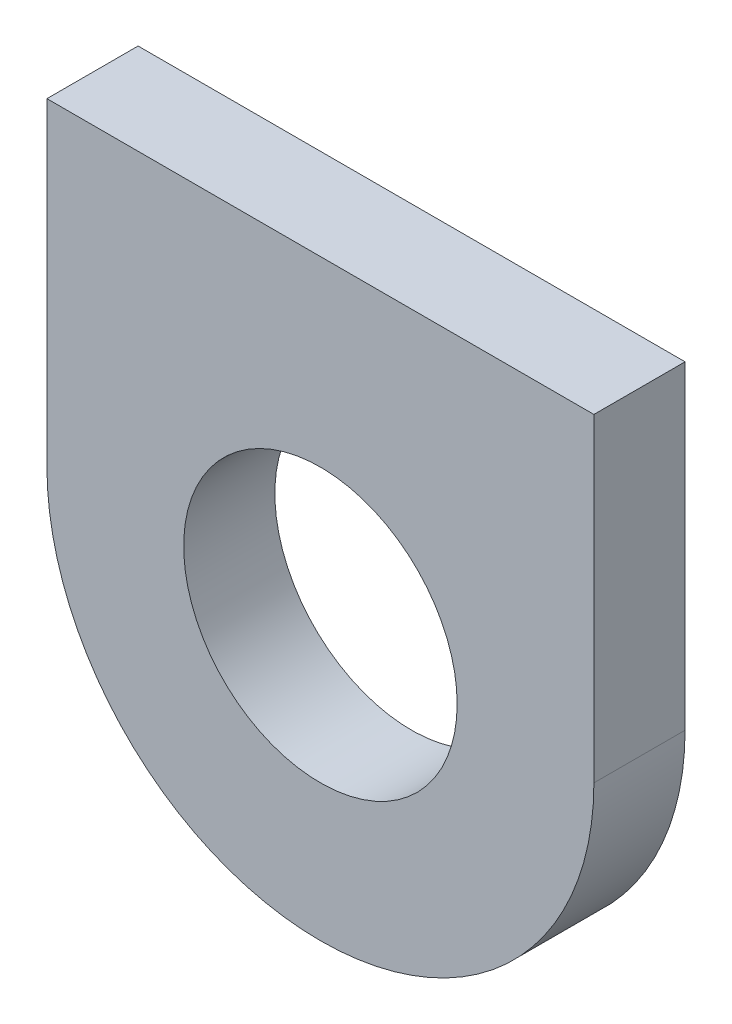
ISO-10303-21;
HEADER;
FILE_DESCRIPTION(('STEP AP214'),'2;1');
FILE_NAME('part.step','',(''),(''),'','','');
FILE_SCHEMA(('AUTOMOTIVE_DESIGN { 1 0 10303 214 1 1 1 1 }'));
ENDSEC;
DATA;
#1=APPLICATION_CONTEXT('core data for automotive mechanical design processes');
#2=APPLICATION_PROTOCOL_DEFINITION('international standard','automotive_design',2000,#1);
#3=PRODUCT_CONTEXT('',#1,'mechanical');
#4=PRODUCT('Part','Part','',(#3));
#5=PRODUCT_RELATED_PRODUCT_CATEGORY('part','',(#4));
#6=PRODUCT_DEFINITION_FORMATION('','',#4);
#7=PRODUCT_DEFINITION_CONTEXT('part definition',#1,'design');
#8=PRODUCT_DEFINITION('design','',#6,#7);
#9=PRODUCT_DEFINITION_SHAPE('','',#8);
#10=(LENGTH_UNIT() NAMED_UNIT(*) SI_UNIT(.MILLI.,.METRE.));
#11=(NAMED_UNIT(*) PLANE_ANGLE_UNIT() SI_UNIT($,.RADIAN.));
#12=(NAMED_UNIT(*) SI_UNIT($,.STERADIAN.) SOLID_ANGLE_UNIT());
#13=UNCERTAINTY_MEASURE_WITH_UNIT(LENGTH_MEASURE(1.E-05),#10,'distance_accuracy_value','');
#14=(GEOMETRIC_REPRESENTATION_CONTEXT(3) GLOBAL_UNCERTAINTY_ASSIGNED_CONTEXT((#13)) GLOBAL_UNIT_ASSIGNED_CONTEXT((#10,
#11,#12)) REPRESENTATION_CONTEXT('',''));
#15=CARTESIAN_POINT('',(0.,0.,0.));
#16=DIRECTION('',(0.,0.,1.));
#17=DIRECTION('',(1.,0.,0.));
#18=AXIS2_PLACEMENT_3D('',#15,#16,#17);
#19=CARTESIAN_POINT('',(0.,0.,10.));
#20=DIRECTION('',(0.,0.,1.));
#21=DIRECTION('',(1.,0.,0.));
#22=AXIS2_PLACEMENT_3D('',#19,#20,#21);
#23=PLANE('',#22);
#24=CARTESIAN_POINT('',(0.,0.,10.));
#25=DIRECTION('',(0.,0.,1.));
#26=DIRECTION('',(1.,0.,0.));
#27=AXIS2_PLACEMENT_3D('',#24,#25,#26);
#28=CIRCLE('',#27,30.);
#29=CARTESIAN_POINT('',(-30.,0.,10.));
#30=VERTEX_POINT('',#29);
#31=CARTESIAN_POINT('',(30.,0.,10.));
#32=VERTEX_POINT('',#31);
#33=EDGE_CURVE('E87',#30,#32,#28,.T.);
#34=ORIENTED_EDGE('',*,*,#33,.T.);
#35=DIRECTION('',(0.,1.,0.));
#36=VECTOR('',#35,1.);
#37=CARTESIAN_POINT('',(30.,35.,10.));
#38=LINE('',#37,#36);
#39=CARTESIAN_POINT('',(30.,35.,10.));
#40=VERTEX_POINT('',#39);
#41=EDGE_CURVE('E82',#32,#40,#38,.T.);
#42=ORIENTED_EDGE('',*,*,#41,.T.);
#43=DIRECTION('',(-1.,0.,0.));
#44=VECTOR('',#43,1.);
#45=CARTESIAN_POINT('',(-30.,35.,10.));
#46=LINE('',#45,#44);
#47=CARTESIAN_POINT('',(-30.,35.,10.));
#48=VERTEX_POINT('',#47);
#49=EDGE_CURVE('E85',#40,#48,#46,.T.);
#50=ORIENTED_EDGE('',*,*,#49,.T.);
#51=DIRECTION('',(0.,-1.,0.));
#52=VECTOR('',#51,1.);
#53=CARTESIAN_POINT('',(-30.,0.,10.));
#54=LINE('',#53,#52);
#55=EDGE_CURVE('E52',#48,#30,#54,.T.);
#56=ORIENTED_EDGE('',*,*,#55,.T.);
#57=EDGE_LOOP('',(#34,#42,#50,#56));
#58=FACE_BOUND('',#57,.T.);
#59=CARTESIAN_POINT('',(0.,0.,10.));
#60=DIRECTION('',(0.,0.,1.));
#61=DIRECTION('',(1.,0.,0.));
#62=AXIS2_PLACEMENT_3D('',#59,#60,#61);
#63=CIRCLE('',#62,15.);
#64=CARTESIAN_POINT('',(15.,0.,10.));
#65=VERTEX_POINT('',#64);
#66=EDGE_CURVE('E102',#65,#65,#63,.T.);
#67=ORIENTED_EDGE('',*,*,#66,.F.);
#68=EDGE_LOOP('',(#67));
#69=FACE_BOUND('',#68,.T.);
#70=ADVANCED_FACE('F35',(#58,#69),#23,.T.);
#71=CARTESIAN_POINT('',(0.,0.,0.));
#72=DIRECTION('',(0.,0.,1.));
#73=DIRECTION('',(1.,0.,0.));
#74=AXIS2_PLACEMENT_3D('',#71,#72,#73);
#75=PLANE('',#74);
#76=CARTESIAN_POINT('',(0.,0.,0.));
#77=DIRECTION('',(0.,0.,1.));
#78=DIRECTION('',(1.,0.,0.));
#79=AXIS2_PLACEMENT_3D('',#76,#77,#78);
#80=CIRCLE('',#79,30.);
#81=CARTESIAN_POINT('',(-30.,0.,0.));
#82=VERTEX_POINT('',#81);
#83=CARTESIAN_POINT('',(30.,0.,0.));
#84=VERTEX_POINT('',#83);
#85=EDGE_CURVE('E99',#82,#84,#80,.T.);
#86=ORIENTED_EDGE('',*,*,#85,.F.);
#87=DIRECTION('',(0.,-1.,0.));
#88=VECTOR('',#87,1.);
#89=CARTESIAN_POINT('',(-30.,0.,0.));
#90=LINE('',#89,#88);
#91=CARTESIAN_POINT('',(-30.,35.,0.));
#92=VERTEX_POINT('',#91);
#93=EDGE_CURVE('E75',#92,#82,#90,.T.);
#94=ORIENTED_EDGE('',*,*,#93,.F.);
#95=DIRECTION('',(-1.,0.,0.));
#96=VECTOR('',#95,1.);
#97=CARTESIAN_POINT('',(-30.,35.,0.));
#98=LINE('',#97,#96);
#99=CARTESIAN_POINT('',(30.,35.,0.));
#100=VERTEX_POINT('',#99);
#101=EDGE_CURVE('E69',#100,#92,#98,.T.);
#102=ORIENTED_EDGE('',*,*,#101,.F.);
#103=DIRECTION('',(0.,1.,0.));
#104=VECTOR('',#103,1.);
#105=CARTESIAN_POINT('',(30.,35.,0.));
#106=LINE('',#105,#104);
#107=EDGE_CURVE('E91',#84,#100,#106,.T.);
#108=ORIENTED_EDGE('',*,*,#107,.F.);
#109=EDGE_LOOP('',(#86,#94,#102,#108));
#110=FACE_BOUND('',#109,.T.);
#111=CARTESIAN_POINT('',(0.,0.,0.));
#112=DIRECTION('',(0.,0.,1.));
#113=DIRECTION('',(1.,0.,0.));
#114=AXIS2_PLACEMENT_3D('',#111,#112,#113);
#115=CIRCLE('',#114,15.);
#116=CARTESIAN_POINT('',(15.,0.,0.));
#117=VERTEX_POINT('',#116);
#118=EDGE_CURVE('E114',#117,#117,#115,.T.);
#119=ORIENTED_EDGE('',*,*,#118,.T.);
#120=EDGE_LOOP('',(#119));
#121=FACE_BOUND('',#120,.T.);
#122=ADVANCED_FACE('F110',(#110,#121),#75,.F.);
#123=CARTESIAN_POINT('',(0.,0.,10.));
#124=DIRECTION('',(0.,0.,-1.));
#125=DIRECTION('',(-1.,0.,0.));
#126=AXIS2_PLACEMENT_3D('',#123,#124,#125);
#127=CYLINDRICAL_SURFACE('',#126,30.);
#128=ORIENTED_EDGE('',*,*,#85,.T.);
#129=DIRECTION('',(0.,0.,-1.));
#130=VECTOR('',#129,1.);
#131=CARTESIAN_POINT('',(30.,0.,10.));
#132=LINE('',#131,#130);
#133=EDGE_CURVE('E11',#32,#84,#132,.T.);
#134=ORIENTED_EDGE('',*,*,#133,.F.);
#135=ORIENTED_EDGE('',*,*,#33,.F.);
#136=DIRECTION('',(0.,0.,-1.));
#137=VECTOR('',#136,1.);
#138=CARTESIAN_POINT('',(-30.,0.,10.));
#139=LINE('',#138,#137);
#140=EDGE_CURVE('E95',#30,#82,#139,.T.);
#141=ORIENTED_EDGE('',*,*,#140,.T.);
#142=EDGE_LOOP('',(#128,#134,#135,#141));
#143=FACE_BOUND('',#142,.T.);
#144=ADVANCED_FACE('F37',(#143),#127,.T.);
#145=CARTESIAN_POINT('',(30.,35.,10.));
#146=DIRECTION('',(-1.,0.,0.));
#147=DIRECTION('',(0.,0.,1.));
#148=AXIS2_PLACEMENT_3D('',#145,#146,#147);
#149=PLANE('',#148);
#150=ORIENTED_EDGE('',*,*,#107,.T.);
#151=DIRECTION('',(0.,0.,-1.));
#152=VECTOR('',#151,1.);
#153=CARTESIAN_POINT('',(30.,35.,10.));
#154=LINE('',#153,#152);
#155=EDGE_CURVE('E44',#40,#100,#154,.T.);
#156=ORIENTED_EDGE('',*,*,#155,.F.);
#157=ORIENTED_EDGE('',*,*,#41,.F.);
#158=ORIENTED_EDGE('',*,*,#133,.T.);
#159=EDGE_LOOP('',(#150,#156,#157,#158));
#160=FACE_BOUND('',#159,.T.);
#161=ADVANCED_FACE('F90',(#160),#149,.F.);
#162=CARTESIAN_POINT('',(-30.,35.,10.));
#163=DIRECTION('',(0.,-1.,0.));
#164=DIRECTION('',(0.,0.,-1.));
#165=AXIS2_PLACEMENT_3D('',#162,#163,#164);
#166=PLANE('',#165);
#167=ORIENTED_EDGE('',*,*,#101,.T.);
#168=DIRECTION('',(0.,0.,-1.));
#169=VECTOR('',#168,1.);
#170=CARTESIAN_POINT('',(-30.,35.,10.));
#171=LINE('',#170,#169);
#172=EDGE_CURVE('E92',#48,#92,#171,.T.);
#173=ORIENTED_EDGE('',*,*,#172,.F.);
#174=ORIENTED_EDGE('',*,*,#49,.F.);
#175=ORIENTED_EDGE('',*,*,#155,.T.);
#176=EDGE_LOOP('',(#167,#173,#174,#175));
#177=FACE_BOUND('',#176,.T.);
#178=ADVANCED_FACE('F93',(#177),#166,.F.);
#179=CARTESIAN_POINT('',(-30.,0.,10.));
#180=DIRECTION('',(1.,0.,0.));
#181=DIRECTION('',(0.,0.,-1.));
#182=AXIS2_PLACEMENT_3D('',#179,#180,#181);
#183=PLANE('',#182);
#184=ORIENTED_EDGE('',*,*,#93,.T.);
#185=ORIENTED_EDGE('',*,*,#140,.F.);
#186=ORIENTED_EDGE('',*,*,#55,.F.);
#187=ORIENTED_EDGE('',*,*,#172,.T.);
#188=EDGE_LOOP('',(#184,#185,#186,#187));
#189=FACE_BOUND('',#188,.T.);
#190=ADVANCED_FACE('F107',(#189),#183,.F.);
#191=CARTESIAN_POINT('',(0.,0.,10.));
#192=DIRECTION('',(0.,0.,-1.));
#193=DIRECTION('',(-1.,0.,0.));
#194=AXIS2_PLACEMENT_3D('',#191,#192,#193);
#195=CYLINDRICAL_SURFACE('',#194,15.);
#196=ORIENTED_EDGE('',*,*,#66,.T.);
#197=EDGE_LOOP('',(#196));
#198=FACE_BOUND('',#197,.T.);
#199=ORIENTED_EDGE('',*,*,#118,.F.);
#200=EDGE_LOOP('',(#199));
#201=FACE_BOUND('',#200,.T.);
#202=ADVANCED_FACE('F120',(#198,#201),#195,.F.);
#203=CLOSED_SHELL('',(#70,#122,#144,#161,#178,#190,#202));
#204=MANIFOLD_SOLID_BREP('B2',#203);
#205=ADVANCED_BREP_SHAPE_REPRESENTATION('',(#18,#204),#14);
#206=SHAPE_DEFINITION_REPRESENTATION(#9,#205);
ENDSEC;
END-ISO-10303-21;
